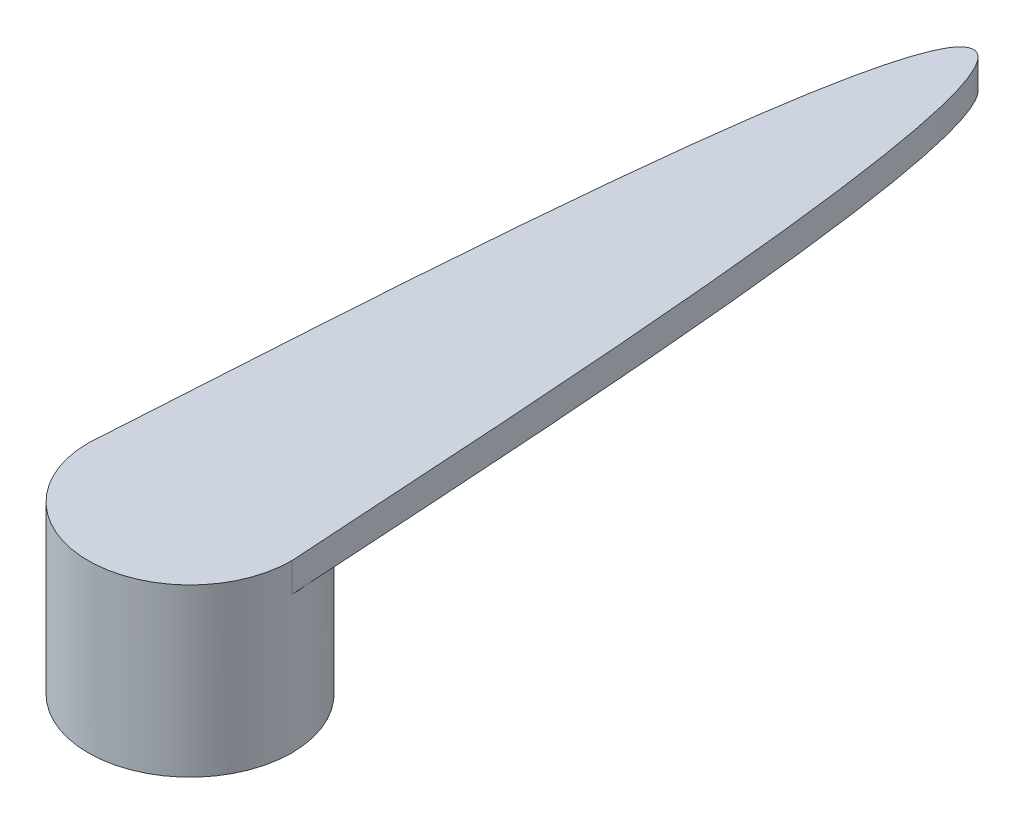
ISO-10303-21;
HEADER;
FILE_DESCRIPTION(('STEP AP214'),'2;1');
FILE_NAME('part.step','',(''),(''),'','','');
FILE_SCHEMA(('AUTOMOTIVE_DESIGN { 1 0 10303 214 1 1 1 1 }'));
ENDSEC;
DATA;
#1=APPLICATION_CONTEXT('core data for automotive mechanical design processes');
#2=APPLICATION_PROTOCOL_DEFINITION('international standard','automotive_design',2000,#1);
#3=PRODUCT_CONTEXT('',#1,'mechanical');
#4=PRODUCT('Part','Part','',(#3));
#5=PRODUCT_RELATED_PRODUCT_CATEGORY('part','',(#4));
#6=PRODUCT_DEFINITION_FORMATION('','',#4);
#7=PRODUCT_DEFINITION_CONTEXT('part definition',#1,'design');
#8=PRODUCT_DEFINITION('design','',#6,#7);
#9=PRODUCT_DEFINITION_SHAPE('','',#8);
#10=(LENGTH_UNIT() NAMED_UNIT(*) SI_UNIT(.MILLI.,.METRE.));
#11=(NAMED_UNIT(*) PLANE_ANGLE_UNIT() SI_UNIT($,.RADIAN.));
#12=(NAMED_UNIT(*) SI_UNIT($,.STERADIAN.) SOLID_ANGLE_UNIT());
#13=UNCERTAINTY_MEASURE_WITH_UNIT(LENGTH_MEASURE(1.E-05),#10,'distance_accuracy_value','');
#14=(GEOMETRIC_REPRESENTATION_CONTEXT(3) GLOBAL_UNCERTAINTY_ASSIGNED_CONTEXT((#13)) GLOBAL_UNIT_ASSIGNED_CONTEXT((#10,
#11,#12)) REPRESENTATION_CONTEXT('',''));
#15=CARTESIAN_POINT('',(0.,0.,0.));
#16=DIRECTION('',(0.,0.,1.));
#17=DIRECTION('',(1.,0.,0.));
#18=AXIS2_PLACEMENT_3D('',#15,#16,#17);
#19=CARTESIAN_POINT('',(0.,7.,0.));
#20=DIRECTION('',(0.,1.,0.));
#21=DIRECTION('',(0.,0.,1.));
#22=AXIS2_PLACEMENT_3D('',#19,#20,#21);
#23=PLANE('',#22);
#24=CARTESIAN_POINT('',(0.,7.,-40.));
#25=CARTESIAN_POINT('',(-3.23114379189861,7.,-40.0000000000001));
#26=CARTESIAN_POINT('',(-4.70656992696443,7.,-6.686332962154));
#27=CARTESIAN_POINT('',(-5.2,7.,0.));
#28=B_SPLINE_CURVE_WITH_KNOTS('',3,(#24,#25,#26,#27),.UNSPECIFIED.,.F.,.F.,(4,4),(0.,1.),.UNSPECIFIED.);
#29=CARTESIAN_POINT('',(-5.14951323197761,7.,-0.722850934624466));
#30=VERTEX_POINT('',#29);
#31=CARTESIAN_POINT('',(-5.2,7.,0.));
#32=VERTEX_POINT('',#31);
#33=EDGE_CURVE('E11',#30,#32,#28,.T.);
#34=ORIENTED_EDGE('',*,*,#33,.F.);
#35=CARTESIAN_POINT('',(0.,7.,0.));
#36=DIRECTION('',(0.,1.,0.));
#37=DIRECTION('',(0.,0.,1.));
#38=AXIS2_PLACEMENT_3D('',#35,#36,#37);
#39=CIRCLE('',#38,5.2);
#40=EDGE_CURVE('E62',#30,#32,#39,.T.);
#41=ORIENTED_EDGE('',*,*,#40,.T.);
#42=EDGE_LOOP('',(#34,#41));
#43=FACE_BOUND('',#42,.T.);
#44=ADVANCED_FACE('F45',(#43),#23,.T.);
#45=CARTESIAN_POINT('',(0.,6.,0.));
#46=DIRECTION('',(0.,-1.,0.));
#47=DIRECTION('',(0.,0.,-1.));
#48=AXIS2_PLACEMENT_3D('',#45,#46,#47);
#49=CYLINDRICAL_SURFACE('',#48,2.3);
#50=CARTESIAN_POINT('',(0.,0.,0.));
#51=DIRECTION('',(0.,1.,0.));
#52=DIRECTION('',(0.,0.,1.));
#53=AXIS2_PLACEMENT_3D('',#50,#51,#52);
#54=CIRCLE('',#53,2.3);
#55=CARTESIAN_POINT('',(-1.6,0.,1.65227116418583));
#56=VERTEX_POINT('',#55);
#57=CARTESIAN_POINT('',(-1.6,0.,-1.65227116418583));
#58=VERTEX_POINT('',#57);
#59=EDGE_CURVE('E132',#56,#58,#54,.T.);
#60=ORIENTED_EDGE('',*,*,#59,.F.);
#61=DIRECTION('',(0.,-1.,0.));
#62=VECTOR('',#61,1.);
#63=CARTESIAN_POINT('',(-1.6,6.,1.65227116418583));
#64=LINE('',#63,#62);
#65=CARTESIAN_POINT('',(-1.6,6.,1.65227116418583));
#66=VERTEX_POINT('',#65);
#67=EDGE_CURVE('E49',#66,#56,#64,.T.);
#68=ORIENTED_EDGE('',*,*,#67,.F.);
#69=CARTESIAN_POINT('',(0.,6.,0.));
#70=DIRECTION('',(0.,1.,0.));
#71=DIRECTION('',(0.,0.,1.));
#72=AXIS2_PLACEMENT_3D('',#69,#70,#71);
#73=CIRCLE('',#72,2.3);
#74=CARTESIAN_POINT('',(-1.6,6.,-1.65227116418583));
#75=VERTEX_POINT('',#74);
#76=EDGE_CURVE('E133',#66,#75,#73,.T.);
#77=ORIENTED_EDGE('',*,*,#76,.T.);
#78=DIRECTION('',(0.,-1.,0.));
#79=VECTOR('',#78,1.);
#80=CARTESIAN_POINT('',(-1.6,6.,-1.65227116418583));
#81=LINE('',#80,#79);
#82=EDGE_CURVE('E142',#75,#58,#81,.T.);
#83=ORIENTED_EDGE('',*,*,#82,.T.);
#84=EDGE_LOOP('',(#60,#68,#77,#83));
#85=FACE_BOUND('',#84,.T.);
#86=ADVANCED_FACE('F47',(#85),#49,.F.);
#87=CARTESIAN_POINT('',(-1.6,6.,0.));
#88=DIRECTION('',(1.,0.,0.));
#89=DIRECTION('',(0.,0.,-1.));
#90=AXIS2_PLACEMENT_3D('',#87,#88,#89);
#91=PLANE('',#90);
#92=DIRECTION('',(0.,0.,1.));
#93=VECTOR('',#92,1.);
#94=CARTESIAN_POINT('',(-1.6,0.,0.));
#95=LINE('',#94,#93);
#96=EDGE_CURVE('E146',#58,#56,#95,.T.);
#97=ORIENTED_EDGE('',*,*,#96,.F.);
#98=ORIENTED_EDGE('',*,*,#82,.F.);
#99=DIRECTION('',(0.,0.,1.));
#100=VECTOR('',#99,1.);
#101=CARTESIAN_POINT('',(-1.6,6.,0.));
#102=LINE('',#101,#100);
#103=EDGE_CURVE('E137',#75,#66,#102,.T.);
#104=ORIENTED_EDGE('',*,*,#103,.T.);
#105=ORIENTED_EDGE('',*,*,#67,.T.);
#106=EDGE_LOOP('',(#97,#98,#104,#105));
#107=FACE_BOUND('',#106,.T.);
#108=ADVANCED_FACE('F160',(#107),#91,.T.);
#109=CARTESIAN_POINT('',(0.,6.,0.));
#110=DIRECTION('',(0.,-1.,0.));
#111=DIRECTION('',(0.,0.,-1.));
#112=AXIS2_PLACEMENT_3D('',#109,#110,#111);
#113=CYLINDRICAL_SURFACE('',#112,5.2);
#114=CARTESIAN_POINT('',(0.,0.,0.));
#115=DIRECTION('',(0.,1.,0.));
#116=DIRECTION('',(0.,0.,1.));
#117=AXIS2_PLACEMENT_3D('',#114,#115,#116);
#118=CIRCLE('',#117,5.2);
#119=CARTESIAN_POINT('',(0.,0.,5.2));
#120=VERTEX_POINT('',#119);
#121=EDGE_CURVE('E138',#120,#120,#118,.T.);
#122=ORIENTED_EDGE('',*,*,#121,.T.);
#123=EDGE_LOOP('',(#122));
#124=FACE_BOUND('',#123,.T.);
#125=CARTESIAN_POINT('',(5.2,7.,0.));
#126=VERTEX_POINT('',#125);
#127=CARTESIAN_POINT('',(5.14951323197801,7.,-0.722850934618616));
#128=VERTEX_POINT('',#127);
#129=EDGE_CURVE('E126',#126,#128,#39,.T.);
#130=ORIENTED_EDGE('',*,*,#129,.F.);
#131=DIRECTION('',(0.,-1.,0.));
#132=VECTOR('',#131,1.);
#133=CARTESIAN_POINT('',(5.2,8.5,0.));
#134=LINE('',#133,#132);
#135=CARTESIAN_POINT('',(5.2,8.5,0.));
#136=VERTEX_POINT('',#135);
#137=EDGE_CURVE('E103',#136,#126,#134,.T.);
#138=ORIENTED_EDGE('',*,*,#137,.F.);
#139=CARTESIAN_POINT('',(0.,8.5,0.));
#140=DIRECTION('',(0.,1.,0.));
#141=DIRECTION('',(0.,0.,-1.));
#142=AXIS2_PLACEMENT_3D('',#139,#140,#141);
#143=CIRCLE('',#142,5.2);
#144=CARTESIAN_POINT('',(-5.2,8.5,0.));
#145=VERTEX_POINT('',#144);
#146=EDGE_CURVE('E96',#145,#136,#143,.T.);
#147=ORIENTED_EDGE('',*,*,#146,.F.);
#148=DIRECTION('',(0.,-1.,0.));
#149=VECTOR('',#148,1.);
#150=CARTESIAN_POINT('',(-5.2,8.5,0.));
#151=LINE('',#150,#149);
#152=EDGE_CURVE('E101',#145,#32,#151,.T.);
#153=ORIENTED_EDGE('',*,*,#152,.T.);
#154=ORIENTED_EDGE('',*,*,#40,.F.);
#155=EDGE_CURVE('E124',#128,#30,#39,.T.);
#156=ORIENTED_EDGE('',*,*,#155,.F.);
#157=EDGE_LOOP('',(#130,#138,#147,#153,#154,#156));
#158=FACE_BOUND('',#157,.T.);
#159=ADVANCED_FACE('F99',(#124,#158),#113,.T.);
#160=CARTESIAN_POINT('',(0.,0.,0.));
#161=DIRECTION('',(0.,1.,0.));
#162=DIRECTION('',(0.,0.,1.));
#163=AXIS2_PLACEMENT_3D('',#160,#161,#162);
#164=PLANE('',#163);
#165=ORIENTED_EDGE('',*,*,#59,.T.);
#166=ORIENTED_EDGE('',*,*,#96,.T.);
#167=EDGE_LOOP('',(#165,#166));
#168=FACE_BOUND('',#167,.T.);
#169=ORIENTED_EDGE('',*,*,#121,.F.);
#170=EDGE_LOOP('',(#169));
#171=FACE_BOUND('',#170,.T.);
#172=ADVANCED_FACE('F162',(#168,#171),#164,.F.);
#173=CARTESIAN_POINT('',(0.,6.,0.));
#174=DIRECTION('',(0.,1.,0.));
#175=DIRECTION('',(0.,0.,1.));
#176=AXIS2_PLACEMENT_3D('',#173,#174,#175);
#177=PLANE('',#176);
#178=ORIENTED_EDGE('',*,*,#76,.F.);
#179=ORIENTED_EDGE('',*,*,#103,.F.);
#180=EDGE_LOOP('',(#178,#179));
#181=FACE_BOUND('',#180,.T.);
#182=ADVANCED_FACE('F165',(#181),#177,.F.);
#183=CARTESIAN_POINT('',(5.2,7.,0.));
#184=CARTESIAN_POINT('',(4.70656992696443,7.,-6.686332962154));
#185=CARTESIAN_POINT('',(3.23114379189861,7.,-40.0000000000001));
#186=CARTESIAN_POINT('',(0.,7.,-40.));
#187=B_SPLINE_CURVE_WITH_KNOTS('',3,(#183,#184,#185,#186),.UNSPECIFIED.,.F.,.F.,(4,4),(0.,1.),.UNSPECIFIED.);
#188=EDGE_CURVE('E116',#126,#128,#187,.T.);
#189=ORIENTED_EDGE('',*,*,#188,.F.);
#190=ORIENTED_EDGE('',*,*,#129,.T.);
#191=EDGE_LOOP('',(#189,#190));
#192=FACE_BOUND('',#191,.T.);
#193=ADVANCED_FACE('F176',(#192),#23,.T.);
#194=CARTESIAN_POINT('',(0.,8.5,-40.));
#195=CARTESIAN_POINT('',(-3.23114379189861,8.5,-40.0000000000001));
#196=CARTESIAN_POINT('',(-4.70656992696443,8.5,-6.686332962154));
#197=CARTESIAN_POINT('',(-5.2,8.5,0.));
#198=B_SPLINE_CURVE_WITH_KNOTS('',3,(#194,#195,#196,#197),.UNSPECIFIED.,.F.,.F.,(4,4),(0.,1.),.UNSPECIFIED.);
#199=DIRECTION('',(0.,-1.,0.));
#200=VECTOR('',#199,1.);
#201=SURFACE_OF_LINEAR_EXTRUSION('',#198,#200);
#202=CARTESIAN_POINT('',(0.,7.,-40.));
#203=VERTEX_POINT('',#202);
#204=EDGE_CURVE('E56',#203,#30,#28,.T.);
#205=ORIENTED_EDGE('',*,*,#204,.T.);
#206=ORIENTED_EDGE('',*,*,#33,.T.);
#207=ORIENTED_EDGE('',*,*,#152,.F.);
#208=CARTESIAN_POINT('',(0.,8.5,-40.));
#209=VERTEX_POINT('',#208);
#210=EDGE_CURVE('E108',#209,#145,#198,.T.);
#211=ORIENTED_EDGE('',*,*,#210,.F.);
#212=DIRECTION('',(0.,-1.,0.));
#213=VECTOR('',#212,1.);
#214=CARTESIAN_POINT('',(0.,8.5,-40.));
#215=LINE('',#214,#213);
#216=EDGE_CURVE('E127',#209,#203,#215,.T.);
#217=ORIENTED_EDGE('',*,*,#216,.T.);
#218=EDGE_LOOP('',(#205,#206,#207,#211,#217));
#219=FACE_BOUND('',#218,.T.);
#220=ADVANCED_FACE('F119',(#219),#201,.F.);
#221=CARTESIAN_POINT('',(5.2,8.5,0.));
#222=CARTESIAN_POINT('',(4.70656992696443,8.5,-6.686332962154));
#223=CARTESIAN_POINT('',(3.23114379189861,8.5,-40.0000000000001));
#224=CARTESIAN_POINT('',(0.,8.5,-40.));
#225=B_SPLINE_CURVE_WITH_KNOTS('',3,(#221,#222,#223,#224),.UNSPECIFIED.,.F.,.F.,(4,4),(0.,1.),.UNSPECIFIED.);
#226=DIRECTION('',(0.,-1.,0.));
#227=VECTOR('',#226,1.);
#228=SURFACE_OF_LINEAR_EXTRUSION('',#225,#227);
#229=ORIENTED_EDGE('',*,*,#188,.T.);
#230=EDGE_CURVE('E194',#128,#203,#187,.T.);
#231=ORIENTED_EDGE('',*,*,#230,.T.);
#232=ORIENTED_EDGE('',*,*,#216,.F.);
#233=EDGE_CURVE('E107',#136,#209,#225,.T.);
#234=ORIENTED_EDGE('',*,*,#233,.F.);
#235=ORIENTED_EDGE('',*,*,#137,.T.);
#236=EDGE_LOOP('',(#229,#231,#232,#234,#235));
#237=FACE_BOUND('',#236,.T.);
#238=ADVANCED_FACE('F188',(#237),#228,.F.);
#239=CARTESIAN_POINT('',(-3.62664264457364,8.5,-22.5073748608078));
#240=DIRECTION('',(0.,-1.,0.));
#241=DIRECTION('',(0.,0.,-1.));
#242=AXIS2_PLACEMENT_3D('',#239,#240,#241);
#243=PLANE('',#242);
#244=ORIENTED_EDGE('',*,*,#210,.T.);
#245=ORIENTED_EDGE('',*,*,#146,.T.);
#246=ORIENTED_EDGE('',*,*,#233,.T.);
#247=EDGE_LOOP('',(#244,#245,#246));
#248=FACE_BOUND('',#247,.T.);
#249=ADVANCED_FACE('F111',(#248),#243,.F.);
#250=CARTESIAN_POINT('',(-3.62664264457364,7.,-22.5073748608078));
#251=DIRECTION('',(0.,-1.,0.));
#252=DIRECTION('',(0.,0.,-1.));
#253=AXIS2_PLACEMENT_3D('',#250,#251,#252);
#254=PLANE('',#253);
#255=ORIENTED_EDGE('',*,*,#230,.F.);
#256=ORIENTED_EDGE('',*,*,#155,.T.);
#257=ORIENTED_EDGE('',*,*,#204,.F.);
#258=EDGE_LOOP('',(#255,#256,#257));
#259=FACE_BOUND('',#258,.T.);
#260=ADVANCED_FACE('F212',(#259),#254,.T.);
#261=CLOSED_SHELL('',(#44,#86,#108,#159,#172,#182,#193,#220,#238,#249,#260));
#262=MANIFOLD_SOLID_BREP('B2',#261);
#263=ADVANCED_BREP_SHAPE_REPRESENTATION('',(#18,#262),#14);
#264=SHAPE_DEFINITION_REPRESENTATION(#9,#263);
ENDSEC;
END-ISO-10303-21;
